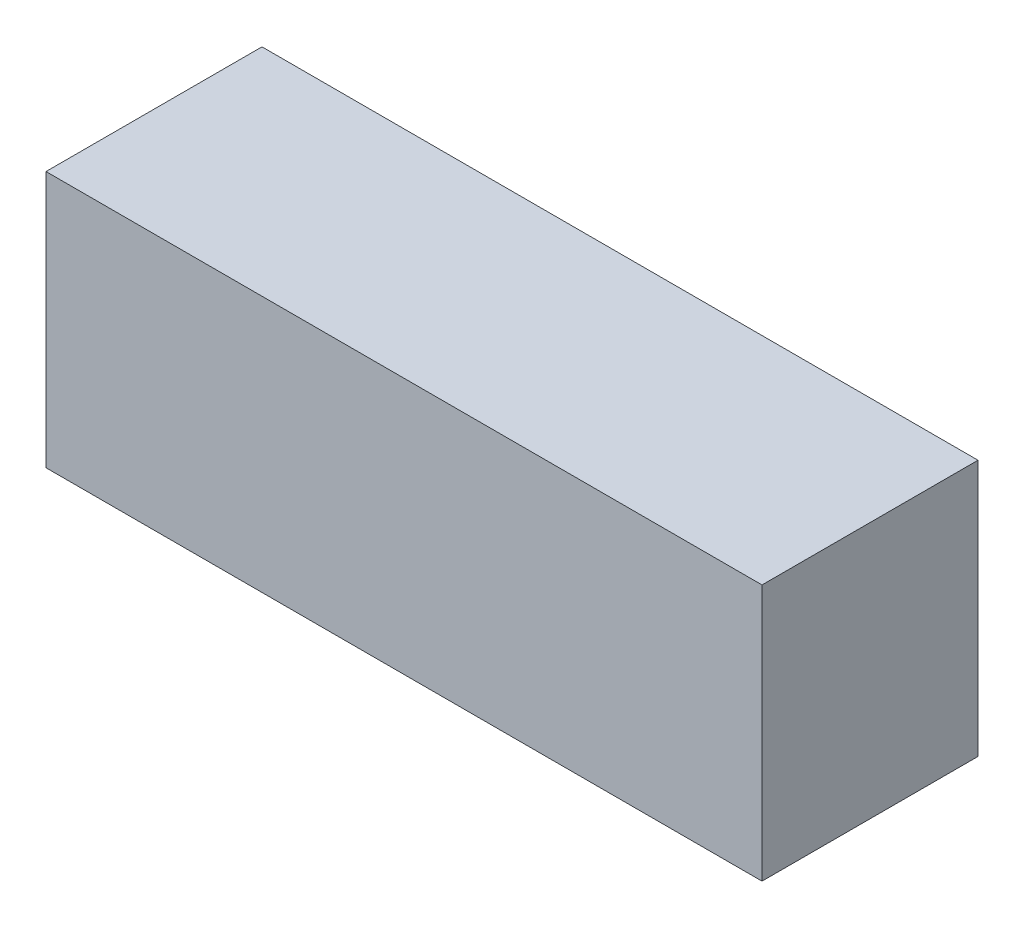
ISO-10303-21;
HEADER;
FILE_DESCRIPTION(('STEP AP214'),'2;1');
FILE_NAME('part.step','',(''),(''),'','','');
FILE_SCHEMA(('AUTOMOTIVE_DESIGN { 1 0 10303 214 1 1 1 1 }'));
ENDSEC;
DATA;
#1=APPLICATION_CONTEXT('core data for automotive mechanical design processes');
#2=APPLICATION_PROTOCOL_DEFINITION('international standard','automotive_design',2000,#1);
#3=PRODUCT_CONTEXT('',#1,'mechanical');
#4=PRODUCT('Part','Part','',(#3));
#5=PRODUCT_RELATED_PRODUCT_CATEGORY('part','',(#4));
#6=PRODUCT_DEFINITION_FORMATION('','',#4);
#7=PRODUCT_DEFINITION_CONTEXT('part definition',#1,'design');
#8=PRODUCT_DEFINITION('design','',#6,#7);
#9=PRODUCT_DEFINITION_SHAPE('','',#8);
#10=(LENGTH_UNIT() NAMED_UNIT(*) SI_UNIT(.MILLI.,.METRE.));
#11=(NAMED_UNIT(*) PLANE_ANGLE_UNIT() SI_UNIT($,.RADIAN.));
#12=(NAMED_UNIT(*) SI_UNIT($,.STERADIAN.) SOLID_ANGLE_UNIT());
#13=UNCERTAINTY_MEASURE_WITH_UNIT(LENGTH_MEASURE(1.E-05),#10,'distance_accuracy_value','');
#14=(GEOMETRIC_REPRESENTATION_CONTEXT(3) GLOBAL_UNCERTAINTY_ASSIGNED_CONTEXT((#13)) GLOBAL_UNIT_ASSIGNED_CONTEXT((#10,
#11,#12)) REPRESENTATION_CONTEXT('',''));
#15=CARTESIAN_POINT('',(0.,0.,0.));
#16=DIRECTION('',(0.,0.,1.));
#17=DIRECTION('',(1.,0.,0.));
#18=AXIS2_PLACEMENT_3D('',#15,#16,#17);
#19=CARTESIAN_POINT('',(69.469,-24.892,41.91));
#20=DIRECTION('',(-1.,0.,0.));
#21=DIRECTION('',(0.,0.,1.));
#22=AXIS2_PLACEMENT_3D('',#19,#20,#21);
#23=PLANE('',#22);
#24=DIRECTION('',(0.,1.,0.));
#25=VECTOR('',#24,1.);
#26=CARTESIAN_POINT('',(69.469,-24.892,0.));
#27=LINE('',#26,#25);
#28=CARTESIAN_POINT('',(69.469,-24.892,0.));
#29=VERTEX_POINT('',#28);
#30=CARTESIAN_POINT('',(69.469,24.892,0.));
#31=VERTEX_POINT('',#30);
#32=EDGE_CURVE('E98',#29,#31,#27,.T.);
#33=ORIENTED_EDGE('',*,*,#32,.T.);
#34=DIRECTION('',(0.,0.,-1.));
#35=VECTOR('',#34,1.);
#36=CARTESIAN_POINT('',(69.469,24.892,41.91));
#37=LINE('',#36,#35);
#38=CARTESIAN_POINT('',(69.469,24.892,41.91));
#39=VERTEX_POINT('',#38);
#40=EDGE_CURVE('E11',#39,#31,#37,.T.);
#41=ORIENTED_EDGE('',*,*,#40,.F.);
#42=DIRECTION('',(0.,1.,0.));
#43=VECTOR('',#42,1.);
#44=CARTESIAN_POINT('',(69.469,-24.892,41.91));
#45=LINE('',#44,#43);
#46=CARTESIAN_POINT('',(69.469,-24.892,41.91));
#47=VERTEX_POINT('',#46);
#48=EDGE_CURVE('E86',#47,#39,#45,.T.);
#49=ORIENTED_EDGE('',*,*,#48,.F.);
#50=DIRECTION('',(0.,0.,-1.));
#51=VECTOR('',#50,1.);
#52=CARTESIAN_POINT('',(69.469,-24.892,41.91));
#53=LINE('',#52,#51);
#54=EDGE_CURVE('E94',#47,#29,#53,.T.);
#55=ORIENTED_EDGE('',*,*,#54,.T.);
#56=EDGE_LOOP('',(#33,#41,#49,#55));
#57=FACE_BOUND('',#56,.T.);
#58=ADVANCED_FACE('F35',(#57),#23,.F.);
#59=CARTESIAN_POINT('',(-69.469,24.892,41.91));
#60=DIRECTION('',(0.,-1.,0.));
#61=DIRECTION('',(0.,0.,-1.));
#62=AXIS2_PLACEMENT_3D('',#59,#60,#61);
#63=PLANE('',#62);
#64=DIRECTION('',(-1.,0.,0.));
#65=VECTOR('',#64,1.);
#66=CARTESIAN_POINT('',(-69.469,24.892,0.));
#67=LINE('',#66,#65);
#68=CARTESIAN_POINT('',(-69.469,24.892,0.));
#69=VERTEX_POINT('',#68);
#70=EDGE_CURVE('E90',#31,#69,#67,.T.);
#71=ORIENTED_EDGE('',*,*,#70,.T.);
#72=DIRECTION('',(0.,0.,-1.));
#73=VECTOR('',#72,1.);
#74=CARTESIAN_POINT('',(-69.469,24.892,41.91));
#75=LINE('',#74,#73);
#76=CARTESIAN_POINT('',(-69.469,24.892,41.91));
#77=VERTEX_POINT('',#76);
#78=EDGE_CURVE('E43',#77,#69,#75,.T.);
#79=ORIENTED_EDGE('',*,*,#78,.F.);
#80=DIRECTION('',(-1.,0.,0.));
#81=VECTOR('',#80,1.);
#82=CARTESIAN_POINT('',(-69.469,24.892,41.91));
#83=LINE('',#82,#81);
#84=EDGE_CURVE('E81',#39,#77,#83,.T.);
#85=ORIENTED_EDGE('',*,*,#84,.F.);
#86=ORIENTED_EDGE('',*,*,#40,.T.);
#87=EDGE_LOOP('',(#71,#79,#85,#86));
#88=FACE_BOUND('',#87,.T.);
#89=ADVANCED_FACE('F89',(#88),#63,.F.);
#90=CARTESIAN_POINT('',(-69.469,-24.892,41.91));
#91=DIRECTION('',(1.,0.,0.));
#92=DIRECTION('',(0.,0.,-1.));
#93=AXIS2_PLACEMENT_3D('',#90,#91,#92);
#94=PLANE('',#93);
#95=DIRECTION('',(0.,-1.,0.));
#96=VECTOR('',#95,1.);
#97=CARTESIAN_POINT('',(-69.469,-24.892,0.));
#98=LINE('',#97,#96);
#99=CARTESIAN_POINT('',(-69.469,-24.892,0.));
#100=VERTEX_POINT('',#99);
#101=EDGE_CURVE('E68',#69,#100,#98,.T.);
#102=ORIENTED_EDGE('',*,*,#101,.T.);
#103=DIRECTION('',(0.,0.,-1.));
#104=VECTOR('',#103,1.);
#105=CARTESIAN_POINT('',(-69.469,-24.892,41.91));
#106=LINE('',#105,#104);
#107=CARTESIAN_POINT('',(-69.469,-24.892,41.91));
#108=VERTEX_POINT('',#107);
#109=EDGE_CURVE('E91',#108,#100,#106,.T.);
#110=ORIENTED_EDGE('',*,*,#109,.F.);
#111=DIRECTION('',(0.,-1.,0.));
#112=VECTOR('',#111,1.);
#113=CARTESIAN_POINT('',(-69.469,-24.892,41.91));
#114=LINE('',#113,#112);
#115=EDGE_CURVE('E84',#77,#108,#114,.T.);
#116=ORIENTED_EDGE('',*,*,#115,.F.);
#117=ORIENTED_EDGE('',*,*,#78,.T.);
#118=EDGE_LOOP('',(#102,#110,#116,#117));
#119=FACE_BOUND('',#118,.T.);
#120=ADVANCED_FACE('F92',(#119),#94,.F.);
#121=CARTESIAN_POINT('',(-69.469,-24.892,41.91));
#122=DIRECTION('',(0.,1.,0.));
#123=DIRECTION('',(0.,0.,1.));
#124=AXIS2_PLACEMENT_3D('',#121,#122,#123);
#125=PLANE('',#124);
#126=DIRECTION('',(1.,0.,0.));
#127=VECTOR('',#126,1.);
#128=CARTESIAN_POINT('',(-69.469,-24.892,0.));
#129=LINE('',#128,#127);
#130=EDGE_CURVE('E74',#100,#29,#129,.T.);
#131=ORIENTED_EDGE('',*,*,#130,.T.);
#132=ORIENTED_EDGE('',*,*,#54,.F.);
#133=DIRECTION('',(1.,0.,0.));
#134=VECTOR('',#133,1.);
#135=CARTESIAN_POINT('',(-69.469,-24.892,41.91));
#136=LINE('',#135,#134);
#137=EDGE_CURVE('E51',#108,#47,#136,.T.);
#138=ORIENTED_EDGE('',*,*,#137,.F.);
#139=ORIENTED_EDGE('',*,*,#109,.T.);
#140=EDGE_LOOP('',(#131,#132,#138,#139));
#141=FACE_BOUND('',#140,.T.);
#142=ADVANCED_FACE('F105',(#141),#125,.F.);
#143=CARTESIAN_POINT('',(0.,0.,41.91));
#144=DIRECTION('',(0.,0.,-1.));
#145=DIRECTION('',(-1.,0.,0.));
#146=AXIS2_PLACEMENT_3D('',#143,#144,#145);
#147=PLANE('',#146);
#148=ORIENTED_EDGE('',*,*,#48,.T.);
#149=ORIENTED_EDGE('',*,*,#84,.T.);
#150=ORIENTED_EDGE('',*,*,#115,.T.);
#151=ORIENTED_EDGE('',*,*,#137,.T.);
#152=EDGE_LOOP('',(#148,#149,#150,#151));
#153=FACE_BOUND('',#152,.T.);
#154=ADVANCED_FACE('F82',(#153),#147,.F.);
#155=CARTESIAN_POINT('',(0.,0.,0.));
#156=DIRECTION('',(0.,0.,-1.));
#157=DIRECTION('',(-1.,0.,0.));
#158=AXIS2_PLACEMENT_3D('',#155,#156,#157);
#159=PLANE('',#158);
#160=ORIENTED_EDGE('',*,*,#32,.F.);
#161=ORIENTED_EDGE('',*,*,#130,.F.);
#162=ORIENTED_EDGE('',*,*,#101,.F.);
#163=ORIENTED_EDGE('',*,*,#70,.F.);
#164=EDGE_LOOP('',(#160,#161,#162,#163));
#165=FACE_BOUND('',#164,.T.);
#166=ADVANCED_FACE('F108',(#165),#159,.T.);
#167=CLOSED_SHELL('',(#58,#89,#120,#142,#154,#166));
#168=MANIFOLD_SOLID_BREP('B2',#167);
#169=ADVANCED_BREP_SHAPE_REPRESENTATION('',(#18,#168),#14);
#170=SHAPE_DEFINITION_REPRESENTATION(#9,#169);
ENDSEC;
END-ISO-10303-21;
